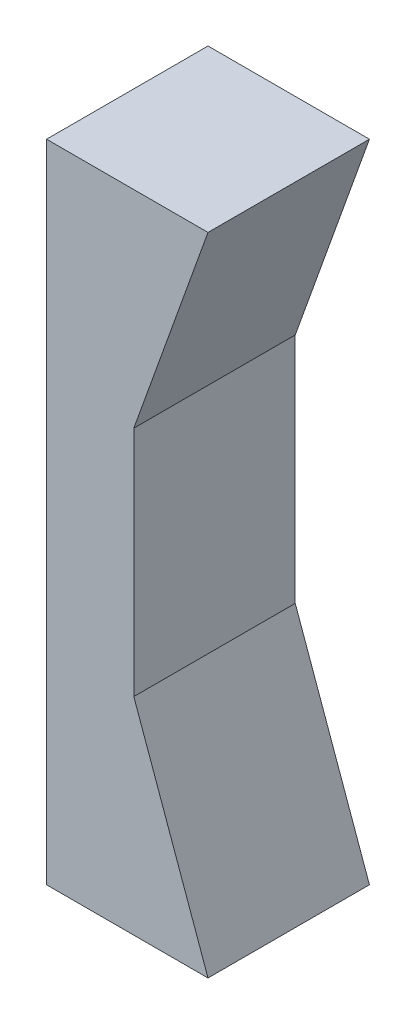
ISO-10303-21;
HEADER;
FILE_DESCRIPTION(('STEP AP214'),'2;1');
FILE_NAME('part.step','',(''),(''),'','','');
FILE_SCHEMA(('AUTOMOTIVE_DESIGN { 1 0 10303 214 1 1 1 1 }'));
ENDSEC;
DATA;
#1=APPLICATION_CONTEXT('core data for automotive mechanical design processes');
#2=APPLICATION_PROTOCOL_DEFINITION('international standard','automotive_design',2000,#1);
#3=PRODUCT_CONTEXT('',#1,'mechanical');
#4=PRODUCT('Part','Part','',(#3));
#5=PRODUCT_RELATED_PRODUCT_CATEGORY('part','',(#4));
#6=PRODUCT_DEFINITION_FORMATION('','',#4);
#7=PRODUCT_DEFINITION_CONTEXT('part definition',#1,'design');
#8=PRODUCT_DEFINITION('design','',#6,#7);
#9=PRODUCT_DEFINITION_SHAPE('','',#8);
#10=(LENGTH_UNIT() NAMED_UNIT(*) SI_UNIT(.MILLI.,.METRE.));
#11=(NAMED_UNIT(*) PLANE_ANGLE_UNIT() SI_UNIT($,.RADIAN.));
#12=(NAMED_UNIT(*) SI_UNIT($,.STERADIAN.) SOLID_ANGLE_UNIT());
#13=UNCERTAINTY_MEASURE_WITH_UNIT(LENGTH_MEASURE(1.E-05),#10,'distance_accuracy_value','');
#14=(GEOMETRIC_REPRESENTATION_CONTEXT(3) GLOBAL_UNCERTAINTY_ASSIGNED_CONTEXT((#13)) GLOBAL_UNIT_ASSIGNED_CONTEXT((#10,
#11,#12)) REPRESENTATION_CONTEXT('',''));
#15=CARTESIAN_POINT('',(0.,0.,0.));
#16=DIRECTION('',(0.,0.,1.));
#17=DIRECTION('',(1.,0.,0.));
#18=AXIS2_PLACEMENT_3D('',#15,#16,#17);
#19=CARTESIAN_POINT('',(0.,0.,250.));
#20=DIRECTION('',(0.,0.,-1.));
#21=DIRECTION('',(-1.,0.,0.));
#22=AXIS2_PLACEMENT_3D('',#19,#20,#21);
#23=PLANE('',#22);
#24=DIRECTION('',(-0.337915449796354,-0.941176470588235,0.));
#25=VECTOR('',#24,1.);
#26=CARTESIAN_POINT('',(125.,500.,250.));
#27=LINE('',#26,#25);
#28=CARTESIAN_POINT('',(125.,500.,250.));
#29=VERTEX_POINT('',#28);
#30=CARTESIAN_POINT('',(10.1087470692395,180.,250.));
#31=VERTEX_POINT('',#30);
#32=EDGE_CURVE('E164',#29,#31,#27,.T.);
#33=ORIENTED_EDGE('',*,*,#32,.F.);
#34=DIRECTION('',(-1.,0.,0.));
#35=VECTOR('',#34,1.);
#36=CARTESIAN_POINT('',(125.,500.,250.));
#37=LINE('',#36,#35);
#38=CARTESIAN_POINT('',(-125.,500.,250.));
#39=VERTEX_POINT('',#38);
#40=EDGE_CURVE('E201',#29,#39,#37,.T.);
#41=ORIENTED_EDGE('',*,*,#40,.T.);
#42=DIRECTION('',(0.,-1.,0.));
#43=VECTOR('',#42,1.);
#44=CARTESIAN_POINT('',(-125.,-500.,250.));
#45=LINE('',#44,#43);
#46=CARTESIAN_POINT('',(-125.,-500.,250.));
#47=VERTEX_POINT('',#46);
#48=EDGE_CURVE('E206',#39,#47,#45,.T.);
#49=ORIENTED_EDGE('',*,*,#48,.T.);
#50=DIRECTION('',(1.,0.,0.));
#51=VECTOR('',#50,1.);
#52=CARTESIAN_POINT('',(125.,-500.,250.));
#53=LINE('',#52,#51);
#54=CARTESIAN_POINT('',(125.,-500.,250.));
#55=VERTEX_POINT('',#54);
#56=EDGE_CURVE('E207',#47,#55,#53,.T.);
#57=ORIENTED_EDGE('',*,*,#56,.T.);
#58=DIRECTION('',(0.337915449796354,-0.941176470588235,0.));
#59=VECTOR('',#58,1.);
#60=CARTESIAN_POINT('',(10.1087470692395,-180.,250.));
#61=LINE('',#60,#59);
#62=CARTESIAN_POINT('',(10.1087470692395,-180.,250.));
#63=VERTEX_POINT('',#62);
#64=EDGE_CURVE('E187',#63,#55,#61,.T.);
#65=ORIENTED_EDGE('',*,*,#64,.F.);
#66=DIRECTION('',(0.,-1.,0.));
#67=VECTOR('',#66,1.);
#68=CARTESIAN_POINT('',(10.1087470692395,180.,250.));
#69=LINE('',#68,#67);
#70=EDGE_CURVE('E194',#31,#63,#69,.T.);
#71=ORIENTED_EDGE('',*,*,#70,.F.);
#72=EDGE_LOOP('',(#33,#41,#49,#57,#65,#71));
#73=FACE_BOUND('',#72,.T.);
#74=ADVANCED_FACE('F39',(#73),#23,.F.);
#75=CARTESIAN_POINT('',(0.,0.,0.));
#76=DIRECTION('',(0.,0.,-1.));
#77=DIRECTION('',(-1.,0.,0.));
#78=AXIS2_PLACEMENT_3D('',#75,#76,#77);
#79=PLANE('',#78);
#80=DIRECTION('',(0.,-1.,0.));
#81=VECTOR('',#80,1.);
#82=CARTESIAN_POINT('',(9.10874706923953,180.,0.));
#83=LINE('',#82,#81);
#84=CARTESIAN_POINT('',(9.10874706923953,180.174077655956,0.));
#85=VERTEX_POINT('',#84);
#86=CARTESIAN_POINT('',(9.10874706923953,-180.174077655956,0.));
#87=VERTEX_POINT('',#86);
#88=EDGE_CURVE('E180',#85,#87,#83,.T.);
#89=ORIENTED_EDGE('',*,*,#88,.F.);
#90=DIRECTION('',(-0.337915449796354,-0.941176470588235,0.));
#91=VECTOR('',#90,1.);
#92=CARTESIAN_POINT('',(124.058823529412,500.337915449796,0.));
#93=LINE('',#92,#91);
#94=CARTESIAN_POINT('',(123.578464834591,499.,0.));
#95=VERTEX_POINT('',#94);
#96=EDGE_CURVE('E161',#95,#85,#93,.T.);
#97=ORIENTED_EDGE('',*,*,#96,.F.);
#98=DIRECTION('',(-1.,0.,0.));
#99=VECTOR('',#98,1.);
#100=CARTESIAN_POINT('',(0.,499.,0.));
#101=LINE('',#100,#99);
#102=CARTESIAN_POINT('',(-124.,499.,0.));
#103=VERTEX_POINT('',#102);
#104=EDGE_CURVE('E53',#95,#103,#101,.T.);
#105=ORIENTED_EDGE('',*,*,#104,.T.);
#106=DIRECTION('',(0.,-1.,0.));
#107=VECTOR('',#106,1.);
#108=CARTESIAN_POINT('',(-124.,0.,0.));
#109=LINE('',#108,#107);
#110=CARTESIAN_POINT('',(-124.,-499.,0.));
#111=VERTEX_POINT('',#110);
#112=EDGE_CURVE('E175',#103,#111,#109,.T.);
#113=ORIENTED_EDGE('',*,*,#112,.T.);
#114=DIRECTION('',(1.,0.,0.));
#115=VECTOR('',#114,1.);
#116=CARTESIAN_POINT('',(0.,-499.,0.));
#117=LINE('',#116,#115);
#118=CARTESIAN_POINT('',(123.578464834591,-499.,0.));
#119=VERTEX_POINT('',#118);
#120=EDGE_CURVE('E148',#111,#119,#117,.T.);
#121=ORIENTED_EDGE('',*,*,#120,.T.);
#122=DIRECTION('',(0.337915449796354,-0.941176470588235,0.));
#123=VECTOR('',#122,1.);
#124=CARTESIAN_POINT('',(9.1675705986513,-180.337915449796,0.));
#125=LINE('',#124,#123);
#126=EDGE_CURVE('E174',#87,#119,#125,.T.);
#127=ORIENTED_EDGE('',*,*,#126,.F.);
#128=EDGE_LOOP('',(#89,#97,#105,#113,#121,#127));
#129=FACE_BOUND('',#128,.T.);
#130=DIRECTION('',(0.,-1.,0.));
#131=VECTOR('',#130,1.);
#132=CARTESIAN_POINT('',(10.1087470692395,180.,0.));
#133=LINE('',#132,#131);
#134=CARTESIAN_POINT('',(10.1087470692395,180.,0.));
#135=VERTEX_POINT('',#134);
#136=CARTESIAN_POINT('',(10.1087470692395,-180.,0.));
#137=VERTEX_POINT('',#136);
#138=EDGE_CURVE('E189',#135,#137,#133,.T.);
#139=ORIENTED_EDGE('',*,*,#138,.T.);
#140=DIRECTION('',(0.337915449796354,-0.941176470588235,0.));
#141=VECTOR('',#140,1.);
#142=CARTESIAN_POINT('',(10.1087470692395,-180.,0.));
#143=LINE('',#142,#141);
#144=CARTESIAN_POINT('',(125.,-500.,0.));
#145=VERTEX_POINT('',#144);
#146=EDGE_CURVE('E64',#137,#145,#143,.T.);
#147=ORIENTED_EDGE('',*,*,#146,.T.);
#148=DIRECTION('',(1.,0.,0.));
#149=VECTOR('',#148,1.);
#150=CARTESIAN_POINT('',(125.,-500.,0.));
#151=LINE('',#150,#149);
#152=CARTESIAN_POINT('',(-125.,-500.,0.));
#153=VERTEX_POINT('',#152);
#154=EDGE_CURVE('E210',#153,#145,#151,.T.);
#155=ORIENTED_EDGE('',*,*,#154,.F.);
#156=DIRECTION('',(0.,-1.,0.));
#157=VECTOR('',#156,1.);
#158=CARTESIAN_POINT('',(-125.,-500.,0.));
#159=LINE('',#158,#157);
#160=CARTESIAN_POINT('',(-125.,500.,0.));
#161=VERTEX_POINT('',#160);
#162=EDGE_CURVE('E214',#161,#153,#159,.T.);
#163=ORIENTED_EDGE('',*,*,#162,.F.);
#164=DIRECTION('',(-1.,0.,0.));
#165=VECTOR('',#164,1.);
#166=CARTESIAN_POINT('',(125.,500.,0.));
#167=LINE('',#166,#165);
#168=CARTESIAN_POINT('',(125.,500.,0.));
#169=VERTEX_POINT('',#168);
#170=EDGE_CURVE('E203',#169,#161,#167,.T.);
#171=ORIENTED_EDGE('',*,*,#170,.F.);
#172=DIRECTION('',(-0.337915449796354,-0.941176470588235,0.));
#173=VECTOR('',#172,1.);
#174=CARTESIAN_POINT('',(125.,500.,0.));
#175=LINE('',#174,#173);
#176=EDGE_CURVE('E184',#169,#135,#175,.T.);
#177=ORIENTED_EDGE('',*,*,#176,.T.);
#178=EDGE_LOOP('',(#139,#147,#155,#163,#171,#177));
#179=FACE_BOUND('',#178,.T.);
#180=ADVANCED_FACE('F231',(#129,#179),#79,.T.);
#181=CARTESIAN_POINT('',(125.,500.,250.));
#182=DIRECTION('',(0.,-1.,0.));
#183=DIRECTION('',(0.,0.,-1.));
#184=AXIS2_PLACEMENT_3D('',#181,#182,#183);
#185=PLANE('',#184);
#186=ORIENTED_EDGE('',*,*,#170,.T.);
#187=DIRECTION('',(0.,0.,-1.));
#188=VECTOR('',#187,1.);
#189=CARTESIAN_POINT('',(-125.,500.,250.));
#190=LINE('',#189,#188);
#191=EDGE_CURVE('E11',#39,#161,#190,.T.);
#192=ORIENTED_EDGE('',*,*,#191,.F.);
#193=ORIENTED_EDGE('',*,*,#40,.F.);
#194=DIRECTION('',(0.,0.,-1.));
#195=VECTOR('',#194,1.);
#196=CARTESIAN_POINT('',(125.,500.,250.));
#197=LINE('',#196,#195);
#198=EDGE_CURVE('E215',#29,#169,#197,.T.);
#199=ORIENTED_EDGE('',*,*,#198,.T.);
#200=EDGE_LOOP('',(#186,#192,#193,#199));
#201=FACE_BOUND('',#200,.T.);
#202=ADVANCED_FACE('F41',(#201),#185,.F.);
#203=CARTESIAN_POINT('',(-125.,-500.,250.));
#204=DIRECTION('',(1.,0.,0.));
#205=DIRECTION('',(0.,0.,-1.));
#206=AXIS2_PLACEMENT_3D('',#203,#204,#205);
#207=PLANE('',#206);
#208=ORIENTED_EDGE('',*,*,#162,.T.);
#209=DIRECTION('',(0.,0.,-1.));
#210=VECTOR('',#209,1.);
#211=CARTESIAN_POINT('',(-125.,-500.,250.));
#212=LINE('',#211,#210);
#213=EDGE_CURVE('E50',#47,#153,#212,.T.);
#214=ORIENTED_EDGE('',*,*,#213,.F.);
#215=ORIENTED_EDGE('',*,*,#48,.F.);
#216=ORIENTED_EDGE('',*,*,#191,.T.);
#217=EDGE_LOOP('',(#208,#214,#215,#216));
#218=FACE_BOUND('',#217,.T.);
#219=ADVANCED_FACE('F242',(#218),#207,.F.);
#220=CARTESIAN_POINT('',(125.,-500.,250.));
#221=DIRECTION('',(0.,1.,0.));
#222=DIRECTION('',(0.,0.,1.));
#223=AXIS2_PLACEMENT_3D('',#220,#221,#222);
#224=PLANE('',#223);
#225=ORIENTED_EDGE('',*,*,#154,.T.);
#226=DIRECTION('',(0.,0.,-1.));
#227=VECTOR('',#226,1.);
#228=CARTESIAN_POINT('',(125.,-500.,250.));
#229=LINE('',#228,#227);
#230=EDGE_CURVE('E222',#55,#145,#229,.T.);
#231=ORIENTED_EDGE('',*,*,#230,.F.);
#232=ORIENTED_EDGE('',*,*,#56,.F.);
#233=ORIENTED_EDGE('',*,*,#213,.T.);
#234=EDGE_LOOP('',(#225,#231,#232,#233));
#235=FACE_BOUND('',#234,.T.);
#236=ADVANCED_FACE('F229',(#235),#224,.F.);
#237=CARTESIAN_POINT('',(10.1087470692395,-180.,0.));
#238=DIRECTION('',(-0.941176470588235,-0.337915449796354,0.));
#239=DIRECTION('',(0.337915449796354,-0.941176470588235,0.));
#240=AXIS2_PLACEMENT_3D('',#237,#238,#239);
#241=PLANE('',#240);
#242=ORIENTED_EDGE('',*,*,#64,.T.);
#243=ORIENTED_EDGE('',*,*,#230,.T.);
#244=ORIENTED_EDGE('',*,*,#146,.F.);
#245=DIRECTION('',(0.,0.,1.));
#246=VECTOR('',#245,1.);
#247=CARTESIAN_POINT('',(10.1087470692395,-180.,0.));
#248=LINE('',#247,#246);
#249=EDGE_CURVE('E200',#137,#63,#248,.T.);
#250=ORIENTED_EDGE('',*,*,#249,.T.);
#251=EDGE_LOOP('',(#242,#243,#244,#250));
#252=FACE_BOUND('',#251,.T.);
#253=ADVANCED_FACE('F236',(#252),#241,.F.);
#254=CARTESIAN_POINT('',(10.1087470692395,180.,0.));
#255=DIRECTION('',(-1.,0.,0.));
#256=DIRECTION('',(0.,0.,1.));
#257=AXIS2_PLACEMENT_3D('',#254,#255,#256);
#258=PLANE('',#257);
#259=ORIENTED_EDGE('',*,*,#70,.T.);
#260=ORIENTED_EDGE('',*,*,#249,.F.);
#261=ORIENTED_EDGE('',*,*,#138,.F.);
#262=DIRECTION('',(0.,0.,1.));
#263=VECTOR('',#262,1.);
#264=CARTESIAN_POINT('',(10.1087470692395,180.,0.));
#265=LINE('',#264,#263);
#266=EDGE_CURVE('E195',#135,#31,#265,.T.);
#267=ORIENTED_EDGE('',*,*,#266,.T.);
#268=EDGE_LOOP('',(#259,#260,#261,#267));
#269=FACE_BOUND('',#268,.T.);
#270=ADVANCED_FACE('F234',(#269),#258,.F.);
#271=CARTESIAN_POINT('',(125.,500.,0.));
#272=DIRECTION('',(-0.941176470588235,0.337915449796354,0.));
#273=DIRECTION('',(-0.337915449796354,-0.941176470588235,0.));
#274=AXIS2_PLACEMENT_3D('',#271,#272,#273);
#275=PLANE('',#274);
#276=ORIENTED_EDGE('',*,*,#32,.T.);
#277=ORIENTED_EDGE('',*,*,#266,.F.);
#278=ORIENTED_EDGE('',*,*,#176,.F.);
#279=ORIENTED_EDGE('',*,*,#198,.F.);
#280=EDGE_LOOP('',(#276,#277,#278,#279));
#281=FACE_BOUND('',#280,.T.);
#282=ADVANCED_FACE('F246',(#281),#275,.F.);
#283=CARTESIAN_POINT('',(0.,0.,249.));
#284=DIRECTION('',(0.,0.,-1.));
#285=DIRECTION('',(-1.,0.,0.));
#286=AXIS2_PLACEMENT_3D('',#283,#284,#285);
#287=PLANE('',#286);
#288=DIRECTION('',(-0.337915449796354,-0.941176470588235,0.));
#289=VECTOR('',#288,1.);
#290=CARTESIAN_POINT('',(124.058823529412,500.337915449796,249.));
#291=LINE('',#290,#289);
#292=CARTESIAN_POINT('',(123.578464834591,499.,249.));
#293=VERTEX_POINT('',#292);
#294=CARTESIAN_POINT('',(9.10874706923953,180.174077655956,249.));
#295=VERTEX_POINT('',#294);
#296=EDGE_CURVE('E163',#293,#295,#291,.T.);
#297=ORIENTED_EDGE('',*,*,#296,.T.);
#298=DIRECTION('',(0.,-1.,0.));
#299=VECTOR('',#298,1.);
#300=CARTESIAN_POINT('',(9.10874706923953,180.,249.));
#301=LINE('',#300,#299);
#302=CARTESIAN_POINT('',(9.10874706923953,-180.174077655956,249.));
#303=VERTEX_POINT('',#302);
#304=EDGE_CURVE('E165',#295,#303,#301,.T.);
#305=ORIENTED_EDGE('',*,*,#304,.T.);
#306=DIRECTION('',(0.337915449796354,-0.941176470588235,0.));
#307=VECTOR('',#306,1.);
#308=CARTESIAN_POINT('',(9.1675705986513,-180.337915449796,249.));
#309=LINE('',#308,#307);
#310=CARTESIAN_POINT('',(123.578464834591,-499.,249.));
#311=VERTEX_POINT('',#310);
#312=EDGE_CURVE('E152',#303,#311,#309,.T.);
#313=ORIENTED_EDGE('',*,*,#312,.T.);
#314=DIRECTION('',(1.,0.,0.));
#315=VECTOR('',#314,1.);
#316=CARTESIAN_POINT('',(0.,-499.,249.));
#317=LINE('',#316,#315);
#318=CARTESIAN_POINT('',(-124.,-499.,249.));
#319=VERTEX_POINT('',#318);
#320=EDGE_CURVE('E137',#319,#311,#317,.T.);
#321=ORIENTED_EDGE('',*,*,#320,.F.);
#322=DIRECTION('',(0.,-1.,0.));
#323=VECTOR('',#322,1.);
#324=CARTESIAN_POINT('',(-124.,0.,249.));
#325=LINE('',#324,#323);
#326=CARTESIAN_POINT('',(-124.,499.,249.));
#327=VERTEX_POINT('',#326);
#328=EDGE_CURVE('E126',#327,#319,#325,.T.);
#329=ORIENTED_EDGE('',*,*,#328,.F.);
#330=DIRECTION('',(-1.,0.,0.));
#331=VECTOR('',#330,1.);
#332=CARTESIAN_POINT('',(0.,499.,249.));
#333=LINE('',#332,#331);
#334=EDGE_CURVE('E138',#293,#327,#333,.T.);
#335=ORIENTED_EDGE('',*,*,#334,.F.);
#336=EDGE_LOOP('',(#297,#305,#313,#321,#329,#335));
#337=FACE_BOUND('',#336,.T.);
#338=ADVANCED_FACE('F151',(#337),#287,.T.);
#339=CARTESIAN_POINT('',(125.,499.,250.));
#340=DIRECTION('',(0.,-1.,0.));
#341=DIRECTION('',(0.,0.,-1.));
#342=AXIS2_PLACEMENT_3D('',#339,#340,#341);
#343=PLANE('',#342);
#344=ORIENTED_EDGE('',*,*,#104,.F.);
#345=DIRECTION('',(0.,0.,-1.));
#346=VECTOR('',#345,1.);
#347=CARTESIAN_POINT('',(123.578464834591,499.,250.));
#348=LINE('',#347,#346);
#349=EDGE_CURVE('E154',#293,#95,#348,.T.);
#350=ORIENTED_EDGE('',*,*,#349,.F.);
#351=ORIENTED_EDGE('',*,*,#334,.T.);
#352=DIRECTION('',(0.,0.,-1.));
#353=VECTOR('',#352,1.);
#354=CARTESIAN_POINT('',(-124.,499.,250.));
#355=LINE('',#354,#353);
#356=EDGE_CURVE('E132',#327,#103,#355,.T.);
#357=ORIENTED_EDGE('',*,*,#356,.T.);
#358=EDGE_LOOP('',(#344,#350,#351,#357));
#359=FACE_BOUND('',#358,.T.);
#360=ADVANCED_FACE('F255',(#359),#343,.T.);
#361=CARTESIAN_POINT('',(-124.,-500.,250.));
#362=DIRECTION('',(1.,0.,0.));
#363=DIRECTION('',(0.,0.,-1.));
#364=AXIS2_PLACEMENT_3D('',#361,#362,#363);
#365=PLANE('',#364);
#366=ORIENTED_EDGE('',*,*,#112,.F.);
#367=ORIENTED_EDGE('',*,*,#356,.F.);
#368=ORIENTED_EDGE('',*,*,#328,.T.);
#369=DIRECTION('',(0.,0.,-1.));
#370=VECTOR('',#369,1.);
#371=CARTESIAN_POINT('',(-124.,-499.,250.));
#372=LINE('',#371,#370);
#373=EDGE_CURVE('E133',#319,#111,#372,.T.);
#374=ORIENTED_EDGE('',*,*,#373,.T.);
#375=EDGE_LOOP('',(#366,#367,#368,#374));
#376=FACE_BOUND('',#375,.T.);
#377=ADVANCED_FACE('F128',(#376),#365,.T.);
#378=CARTESIAN_POINT('',(125.,-499.,250.));
#379=DIRECTION('',(0.,1.,0.));
#380=DIRECTION('',(0.,0.,1.));
#381=AXIS2_PLACEMENT_3D('',#378,#379,#380);
#382=PLANE('',#381);
#383=ORIENTED_EDGE('',*,*,#120,.F.);
#384=ORIENTED_EDGE('',*,*,#373,.F.);
#385=ORIENTED_EDGE('',*,*,#320,.T.);
#386=DIRECTION('',(0.,0.,-1.));
#387=VECTOR('',#386,1.);
#388=CARTESIAN_POINT('',(123.578464834591,-499.,0.));
#389=LINE('',#388,#387);
#390=EDGE_CURVE('E146',#311,#119,#389,.T.);
#391=ORIENTED_EDGE('',*,*,#390,.T.);
#392=EDGE_LOOP('',(#383,#384,#385,#391));
#393=FACE_BOUND('',#392,.T.);
#394=ADVANCED_FACE('F141',(#393),#382,.T.);
#395=CARTESIAN_POINT('',(9.1675705986513,-180.337915449796,0.));
#396=DIRECTION('',(-0.941176470588235,-0.337915449796354,0.));
#397=DIRECTION('',(0.337915449796354,-0.941176470588235,0.));
#398=AXIS2_PLACEMENT_3D('',#395,#396,#397);
#399=PLANE('',#398);
#400=ORIENTED_EDGE('',*,*,#312,.F.);
#401=DIRECTION('',(0.,0.,1.));
#402=VECTOR('',#401,1.);
#403=CARTESIAN_POINT('',(9.10874706923953,-180.174077655956,0.));
#404=LINE('',#403,#402);
#405=EDGE_CURVE('E169',#87,#303,#404,.T.);
#406=ORIENTED_EDGE('',*,*,#405,.F.);
#407=ORIENTED_EDGE('',*,*,#126,.T.);
#408=ORIENTED_EDGE('',*,*,#390,.F.);
#409=EDGE_LOOP('',(#400,#406,#407,#408));
#410=FACE_BOUND('',#409,.T.);
#411=ADVANCED_FACE('F326',(#410),#399,.T.);
#412=CARTESIAN_POINT('',(9.10874706923953,180.,0.));
#413=DIRECTION('',(-1.,0.,0.));
#414=DIRECTION('',(0.,0.,1.));
#415=AXIS2_PLACEMENT_3D('',#412,#413,#414);
#416=PLANE('',#415);
#417=ORIENTED_EDGE('',*,*,#304,.F.);
#418=DIRECTION('',(0.,0.,1.));
#419=VECTOR('',#418,1.);
#420=CARTESIAN_POINT('',(9.10874706923954,180.174077655956,0.));
#421=LINE('',#420,#419);
#422=EDGE_CURVE('E168',#85,#295,#421,.T.);
#423=ORIENTED_EDGE('',*,*,#422,.F.);
#424=ORIENTED_EDGE('',*,*,#88,.T.);
#425=ORIENTED_EDGE('',*,*,#405,.T.);
#426=EDGE_LOOP('',(#417,#423,#424,#425));
#427=FACE_BOUND('',#426,.T.);
#428=ADVANCED_FACE('F333',(#427),#416,.T.);
#429=CARTESIAN_POINT('',(124.058823529412,500.337915449796,0.));
#430=DIRECTION('',(-0.941176470588235,0.337915449796354,0.));
#431=DIRECTION('',(-0.337915449796354,-0.941176470588235,0.));
#432=AXIS2_PLACEMENT_3D('',#429,#430,#431);
#433=PLANE('',#432);
#434=ORIENTED_EDGE('',*,*,#296,.F.);
#435=ORIENTED_EDGE('',*,*,#349,.T.);
#436=ORIENTED_EDGE('',*,*,#96,.T.);
#437=ORIENTED_EDGE('',*,*,#422,.T.);
#438=EDGE_LOOP('',(#434,#435,#436,#437));
#439=FACE_BOUND('',#438,.T.);
#440=ADVANCED_FACE('F344',(#439),#433,.T.);
#441=CLOSED_SHELL('',(#74,#180,#202,#219,#236,#253,#270,#282,#338,#360,#377,#394,#411,#428,#440));
#442=MANIFOLD_SOLID_BREP('B2',#441);
#443=ADVANCED_BREP_SHAPE_REPRESENTATION('',(#18,#442),#14);
#444=SHAPE_DEFINITION_REPRESENTATION(#9,#443);
ENDSEC;
END-ISO-10303-21;
